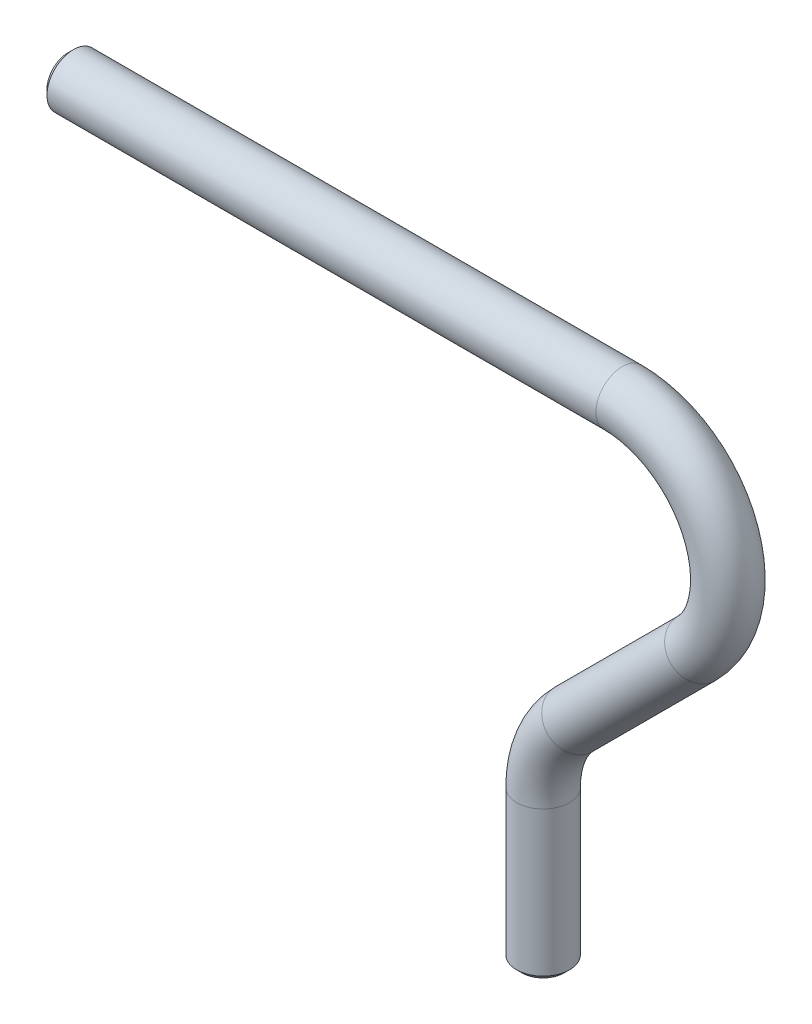
ISO-10303-21;
HEADER;
FILE_DESCRIPTION(('STEP AP214'),'2;1');
FILE_NAME('part.step','',(''),(''),'','','');
FILE_SCHEMA(('AUTOMOTIVE_DESIGN { 1 0 10303 214 1 1 1 1 }'));
ENDSEC;
DATA;
#1=APPLICATION_CONTEXT('core data for automotive mechanical design processes');
#2=APPLICATION_PROTOCOL_DEFINITION('international standard','automotive_design',2000,#1);
#3=PRODUCT_CONTEXT('',#1,'mechanical');
#4=PRODUCT('Part','Part','',(#3));
#5=PRODUCT_RELATED_PRODUCT_CATEGORY('part','',(#4));
#6=PRODUCT_DEFINITION_FORMATION('','',#4);
#7=PRODUCT_DEFINITION_CONTEXT('part definition',#1,'design');
#8=PRODUCT_DEFINITION('design','',#6,#7);
#9=PRODUCT_DEFINITION_SHAPE('','',#8);
#10=(LENGTH_UNIT() NAMED_UNIT(*) SI_UNIT(.MILLI.,.METRE.));
#11=(NAMED_UNIT(*) PLANE_ANGLE_UNIT() SI_UNIT($,.RADIAN.));
#12=(NAMED_UNIT(*) SI_UNIT($,.STERADIAN.) SOLID_ANGLE_UNIT());
#13=UNCERTAINTY_MEASURE_WITH_UNIT(LENGTH_MEASURE(1.E-05),#10,'distance_accuracy_value','');
#14=(GEOMETRIC_REPRESENTATION_CONTEXT(3) GLOBAL_UNCERTAINTY_ASSIGNED_CONTEXT((#13)) GLOBAL_UNIT_ASSIGNED_CONTEXT((#10,
#11,#12)) REPRESENTATION_CONTEXT('',''));
#15=CARTESIAN_POINT('',(0.,0.,0.));
#16=DIRECTION('',(0.,0.,1.));
#17=DIRECTION('',(1.,0.,0.));
#18=AXIS2_PLACEMENT_3D('',#15,#16,#17);
#19=CARTESIAN_POINT('',(0.,0.,0.));
#20=DIRECTION('',(1.,0.,0.));
#21=DIRECTION('',(0.,0.,-1.));
#22=AXIS2_PLACEMENT_3D('',#19,#20,#21);
#23=CYLINDRICAL_SURFACE('',#22,5.);
#24=CARTESIAN_POINT('',(0.999999999999979,0.,0.));
#25=DIRECTION('',(1.,0.,0.));
#26=DIRECTION('',(0.,0.,-1.));
#27=AXIS2_PLACEMENT_3D('',#24,#25,#26);
#28=CIRCLE('',#27,5.);
#29=CARTESIAN_POINT('',(0.999999999999979,0.,-5.));
#30=VERTEX_POINT('',#29);
#31=EDGE_CURVE('E49',#30,#30,#28,.T.);
#32=ORIENTED_EDGE('',*,*,#31,.T.);
#33=EDGE_LOOP('',(#32));
#34=FACE_BOUND('',#33,.T.);
#35=CARTESIAN_POINT('',(105.,0.,0.));
#36=DIRECTION('',(1.,0.,0.));
#37=DIRECTION('',(0.,0.,-1.));
#38=AXIS2_PLACEMENT_3D('',#35,#36,#37);
#39=CIRCLE('',#38,5.);
#40=CARTESIAN_POINT('',(105.,5.,0.));
#41=VERTEX_POINT('',#40);
#42=EDGE_CURVE('E73',#41,#41,#39,.T.);
#43=ORIENTED_EDGE('',*,*,#42,.F.);
#44=EDGE_LOOP('',(#43));
#45=FACE_BOUND('',#44,.T.);
#46=ADVANCED_FACE('F41',(#34,#45),#23,.T.);
#47=CARTESIAN_POINT('',(105.,-20.,0.));
#48=DIRECTION('',(0.,0.,-1.));
#49=DIRECTION('',(-1.,0.,0.));
#50=AXIS2_PLACEMENT_3D('',#47,#48,#49);
#51=TOROIDAL_SURFACE('',#50,20.,5.);
#52=CARTESIAN_POINT('',(119.142135623731,-34.142135623731,0.));
#53=DIRECTION('',(-0.707106781186552,-0.707106781186543,0.));
#54=DIRECTION('',(0.,0.,-1.));
#55=AXIS2_PLACEMENT_3D('',#52,#53,#54);
#56=CIRCLE('',#55,5.);
#57=CARTESIAN_POINT('',(122.677669529664,-37.6776695296638,0.));
#58=VERTEX_POINT('',#57);
#59=EDGE_CURVE('E70',#58,#58,#56,.T.);
#60=CARTESIAN_POINT('',(105.,-20.,0.));
#61=DIRECTION('',(0.,0.,-1.));
#62=DIRECTION('',(-1.,0.,0.));
#63=AXIS2_PLACEMENT_3D('',#60,#61,#62);
#64=CIRCLE('',#63,25.);
#65=EDGE_CURVE('',#41,#58,#64,.T.);
#66=ORIENTED_EDGE('',*,*,#42,.T.);
#67=ORIENTED_EDGE('',*,*,#59,.F.);
#68=ORIENTED_EDGE('',*,*,#65,.T.);
#69=ORIENTED_EDGE('',*,*,#65,.F.);
#70=EDGE_LOOP('',(#66,#68,#67,#69));
#71=FACE_BOUND('',#70,.T.);
#72=ADVANCED_FACE('F172',(#71),#51,.T.);
#73=CARTESIAN_POINT('',(119.142135623731,-34.142135623731,0.));
#74=DIRECTION('',(-0.707106781186551,-0.707106781186544,0.));
#75=DIRECTION('',(0.707106781186544,-0.707106781186551,0.));
#76=AXIS2_PLACEMENT_3D('',#73,#74,#75);
#77=CYLINDRICAL_SURFACE('',#76,5.);
#78=CARTESIAN_POINT('',(95.8578643762691,-57.4264068711925,0.));
#79=DIRECTION('',(-0.707106781186551,-0.707106781186544,0.));
#80=DIRECTION('',(0.,0.,-1.));
#81=AXIS2_PLACEMENT_3D('',#78,#79,#80);
#82=CIRCLE('',#81,5.);
#83=CARTESIAN_POINT('',(92.3223304703364,-53.8908729652598,0.));
#84=VERTEX_POINT('',#83);
#85=EDGE_CURVE('E67',#84,#84,#82,.T.);
#86=ORIENTED_EDGE('',*,*,#85,.F.);
#87=EDGE_LOOP('',(#86));
#88=FACE_BOUND('',#87,.T.);
#89=ORIENTED_EDGE('',*,*,#59,.T.);
#90=EDGE_LOOP('',(#89));
#91=FACE_BOUND('',#90,.T.);
#92=ADVANCED_FACE('F234',(#88,#91),#77,.T.);
#93=CARTESIAN_POINT('',(110.,-71.5685424949236,0.));
#94=DIRECTION('',(0.,0.,1.));
#95=DIRECTION('',(1.,0.,0.));
#96=AXIS2_PLACEMENT_3D('',#93,#94,#95);
#97=TOROIDAL_SURFACE('',#96,20.,5.);
#98=CARTESIAN_POINT('',(90.,-71.5685424949236,0.));
#99=DIRECTION('',(0.,-1.,0.));
#100=DIRECTION('',(0.,0.,-1.));
#101=AXIS2_PLACEMENT_3D('',#98,#99,#100);
#102=CIRCLE('',#101,5.);
#103=CARTESIAN_POINT('',(85.,-71.5685424949236,0.));
#104=VERTEX_POINT('',#103);
#105=EDGE_CURVE('E63',#104,#104,#102,.T.);
#106=CARTESIAN_POINT('',(110.,-71.5685424949236,0.));
#107=DIRECTION('',(0.,0.,1.));
#108=DIRECTION('',(1.,0.,0.));
#109=AXIS2_PLACEMENT_3D('',#106,#107,#108);
#110=CIRCLE('',#109,25.);
#111=EDGE_CURVE('',#84,#104,#110,.T.);
#112=ORIENTED_EDGE('',*,*,#85,.T.);
#113=ORIENTED_EDGE('',*,*,#105,.F.);
#114=ORIENTED_EDGE('',*,*,#111,.T.);
#115=ORIENTED_EDGE('',*,*,#111,.F.);
#116=EDGE_LOOP('',(#112,#114,#113,#115));
#117=FACE_BOUND('',#116,.T.);
#118=ADVANCED_FACE('F106',(#117),#97,.T.);
#119=CARTESIAN_POINT('',(90.,-71.5685424949236,0.));
#120=DIRECTION('',(0.,-1.,0.));
#121=DIRECTION('',(0.,0.,-1.));
#122=AXIS2_PLACEMENT_3D('',#119,#120,#121);
#123=CYLINDRICAL_SURFACE('',#122,5.);
#124=CARTESIAN_POINT('',(90.,-99.,0.));
#125=DIRECTION('',(0.,-1.,0.));
#126=DIRECTION('',(0.,0.,-1.));
#127=AXIS2_PLACEMENT_3D('',#124,#125,#126);
#128=CIRCLE('',#127,5.);
#129=CARTESIAN_POINT('',(90.,-99.,-5.));
#130=VERTEX_POINT('',#129);
#131=EDGE_CURVE('E53',#130,#130,#128,.F.);
#132=ORIENTED_EDGE('',*,*,#131,.T.);
#133=EDGE_LOOP('',(#132));
#134=FACE_BOUND('',#133,.T.);
#135=ORIENTED_EDGE('',*,*,#105,.T.);
#136=EDGE_LOOP('',(#135));
#137=FACE_BOUND('',#136,.T.);
#138=ADVANCED_FACE('F98',(#134,#137),#123,.T.);
#139=CARTESIAN_POINT('',(0.,0.,0.));
#140=DIRECTION('',(1.,0.,0.));
#141=DIRECTION('',(0.,0.,-1.));
#142=AXIS2_PLACEMENT_3D('',#139,#140,#141);
#143=PLANE('',#142);
#144=CARTESIAN_POINT('',(0.,0.,0.));
#145=DIRECTION('',(1.,0.,0.));
#146=DIRECTION('',(0.,0.,-1.));
#147=AXIS2_PLACEMENT_3D('',#144,#145,#146);
#148=CIRCLE('',#147,4.00000000000002);
#149=CARTESIAN_POINT('',(0.,0.,-4.00000000000002));
#150=VERTEX_POINT('',#149);
#151=EDGE_CURVE('E10',#150,#150,#148,.F.);
#152=ORIENTED_EDGE('',*,*,#151,.T.);
#153=EDGE_LOOP('',(#152));
#154=FACE_BOUND('',#153,.T.);
#155=CARTESIAN_POINT('',(0.,0.,0.));
#156=DIRECTION('',(1.,0.,0.));
#157=DIRECTION('',(0.,0.,-1.));
#158=AXIS2_PLACEMENT_3D('',#155,#156,#157);
#159=CIRCLE('',#158,3.);
#160=CARTESIAN_POINT('',(0.,0.,-3.));
#161=VERTEX_POINT('',#160);
#162=EDGE_CURVE('E66',#161,#161,#159,.F.);
#163=ORIENTED_EDGE('',*,*,#162,.F.);
#164=EDGE_LOOP('',(#163));
#165=FACE_BOUND('',#164,.T.);
#166=ADVANCED_FACE('F95',(#154,#165),#143,.F.);
#167=CARTESIAN_POINT('',(90.,-100.,0.));
#168=DIRECTION('',(0.,-1.,0.));
#169=DIRECTION('',(0.,0.,-1.));
#170=AXIS2_PLACEMENT_3D('',#167,#168,#169);
#171=PLANE('',#170);
#172=CARTESIAN_POINT('',(90.,-100.,0.));
#173=DIRECTION('',(0.,-1.,0.));
#174=DIRECTION('',(0.,0.,-1.));
#175=AXIS2_PLACEMENT_3D('',#172,#173,#174);
#176=CIRCLE('',#175,4.00000000000002);
#177=CARTESIAN_POINT('',(90.,-100.,-4.00000000000002));
#178=VERTEX_POINT('',#177);
#179=EDGE_CURVE('E57',#178,#178,#176,.T.);
#180=ORIENTED_EDGE('',*,*,#179,.T.);
#181=EDGE_LOOP('',(#180));
#182=FACE_BOUND('',#181,.T.);
#183=CARTESIAN_POINT('',(90.,-100.,0.));
#184=DIRECTION('',(0.,-1.,0.));
#185=DIRECTION('',(0.,0.,-1.));
#186=AXIS2_PLACEMENT_3D('',#183,#184,#185);
#187=CIRCLE('',#186,3.);
#188=CARTESIAN_POINT('',(90.,-100.,-3.));
#189=VERTEX_POINT('',#188);
#190=EDGE_CURVE('E62',#189,#189,#187,.F.);
#191=ORIENTED_EDGE('',*,*,#190,.T.);
#192=EDGE_LOOP('',(#191));
#193=FACE_BOUND('',#192,.T.);
#194=ADVANCED_FACE('F97',(#182,#193),#171,.T.);
#195=CARTESIAN_POINT('',(0.,0.,0.));
#196=DIRECTION('',(1.,0.,0.));
#197=DIRECTION('',(0.,0.,-1.));
#198=AXIS2_PLACEMENT_3D('',#195,#196,#197);
#199=CYLINDRICAL_SURFACE('',#198,3.);
#200=CARTESIAN_POINT('',(105.,0.,0.));
#201=DIRECTION('',(1.,0.,0.));
#202=DIRECTION('',(0.,0.,-1.));
#203=AXIS2_PLACEMENT_3D('',#200,#201,#202);
#204=CIRCLE('',#203,3.);
#205=CARTESIAN_POINT('',(105.,3.,0.));
#206=VERTEX_POINT('',#205);
#207=EDGE_CURVE('E87',#206,#206,#204,.F.);
#208=ORIENTED_EDGE('',*,*,#207,.F.);
#209=EDGE_LOOP('',(#208));
#210=FACE_BOUND('',#209,.T.);
#211=ORIENTED_EDGE('',*,*,#162,.T.);
#212=EDGE_LOOP('',(#211));
#213=FACE_BOUND('',#212,.T.);
#214=ADVANCED_FACE('F93',(#210,#213),#199,.F.);
#215=CARTESIAN_POINT('',(105.,-20.,0.));
#216=DIRECTION('',(0.,0.,-1.));
#217=DIRECTION('',(-1.,0.,0.));
#218=AXIS2_PLACEMENT_3D('',#215,#216,#217);
#219=TOROIDAL_SURFACE('',#218,20.,3.);
#220=CARTESIAN_POINT('',(119.142135623731,-34.142135623731,0.));
#221=DIRECTION('',(-0.707106781186552,-0.707106781186543,0.));
#222=DIRECTION('',(0.,0.,-1.));
#223=AXIS2_PLACEMENT_3D('',#220,#221,#222);
#224=CIRCLE('',#223,3.);
#225=CARTESIAN_POINT('',(121.26345596729,-36.2634559672907,0.));
#226=VERTEX_POINT('',#225);
#227=EDGE_CURVE('E84',#226,#226,#224,.F.);
#228=CARTESIAN_POINT('',(105.,-20.,0.));
#229=DIRECTION('',(0.,0.,-1.));
#230=DIRECTION('',(-1.,0.,0.));
#231=AXIS2_PLACEMENT_3D('',#228,#229,#230);
#232=CIRCLE('',#231,23.);
#233=EDGE_CURVE('',#206,#226,#232,.T.);
#234=ORIENTED_EDGE('',*,*,#207,.T.);
#235=ORIENTED_EDGE('',*,*,#227,.F.);
#236=ORIENTED_EDGE('',*,*,#233,.T.);
#237=ORIENTED_EDGE('',*,*,#233,.F.);
#238=EDGE_LOOP('',(#234,#236,#235,#237));
#239=FACE_BOUND('',#238,.T.);
#240=ADVANCED_FACE('F129',(#239),#219,.F.);
#241=CARTESIAN_POINT('',(119.142135623731,-34.142135623731,0.));
#242=DIRECTION('',(-0.707106781186551,-0.707106781186544,0.));
#243=DIRECTION('',(0.707106781186544,-0.707106781186551,0.));
#244=AXIS2_PLACEMENT_3D('',#241,#242,#243);
#245=CYLINDRICAL_SURFACE('',#244,3.);
#246=CARTESIAN_POINT('',(95.8578643762691,-57.4264068711925,0.));
#247=DIRECTION('',(-0.707106781186551,-0.707106781186544,0.));
#248=DIRECTION('',(0.,0.,-1.));
#249=AXIS2_PLACEMENT_3D('',#246,#247,#248);
#250=CIRCLE('',#249,3.);
#251=CARTESIAN_POINT('',(93.7365440327095,-55.3050865276329,0.));
#252=VERTEX_POINT('',#251);
#253=EDGE_CURVE('E81',#252,#252,#250,.F.);
#254=ORIENTED_EDGE('',*,*,#253,.F.);
#255=EDGE_LOOP('',(#254));
#256=FACE_BOUND('',#255,.T.);
#257=ORIENTED_EDGE('',*,*,#227,.T.);
#258=EDGE_LOOP('',(#257));
#259=FACE_BOUND('',#258,.T.);
#260=ADVANCED_FACE('F121',(#256,#259),#245,.F.);
#261=CARTESIAN_POINT('',(110.,-71.5685424949236,0.));
#262=DIRECTION('',(0.,0.,1.));
#263=DIRECTION('',(1.,0.,0.));
#264=AXIS2_PLACEMENT_3D('',#261,#262,#263);
#265=TOROIDAL_SURFACE('',#264,20.,3.);
#266=CARTESIAN_POINT('',(90.,-71.5685424949236,0.));
#267=DIRECTION('',(0.,-1.,0.));
#268=DIRECTION('',(0.,0.,-1.));
#269=AXIS2_PLACEMENT_3D('',#266,#267,#268);
#270=CIRCLE('',#269,3.);
#271=CARTESIAN_POINT('',(87.,-71.5685424949236,0.));
#272=VERTEX_POINT('',#271);
#273=EDGE_CURVE('E78',#272,#272,#270,.F.);
#274=CARTESIAN_POINT('',(110.,-71.5685424949236,0.));
#275=DIRECTION('',(0.,0.,1.));
#276=DIRECTION('',(1.,0.,0.));
#277=AXIS2_PLACEMENT_3D('',#274,#275,#276);
#278=CIRCLE('',#277,23.);
#279=EDGE_CURVE('',#252,#272,#278,.T.);
#280=ORIENTED_EDGE('',*,*,#253,.T.);
#281=ORIENTED_EDGE('',*,*,#273,.F.);
#282=ORIENTED_EDGE('',*,*,#279,.T.);
#283=ORIENTED_EDGE('',*,*,#279,.F.);
#284=EDGE_LOOP('',(#280,#282,#281,#283));
#285=FACE_BOUND('',#284,.T.);
#286=ADVANCED_FACE('F113',(#285),#265,.F.);
#287=CARTESIAN_POINT('',(90.,-71.5685424949236,0.));
#288=DIRECTION('',(0.,-1.,0.));
#289=DIRECTION('',(0.,0.,-1.));
#290=AXIS2_PLACEMENT_3D('',#287,#288,#289);
#291=CYLINDRICAL_SURFACE('',#290,3.);
#292=ORIENTED_EDGE('',*,*,#190,.F.);
#293=EDGE_LOOP('',(#292));
#294=FACE_BOUND('',#293,.T.);
#295=ORIENTED_EDGE('',*,*,#273,.T.);
#296=EDGE_LOOP('',(#295));
#297=FACE_BOUND('',#296,.T.);
#298=ADVANCED_FACE('F110',(#294,#297),#291,.F.);
#299=CARTESIAN_POINT('',(90.,-100.,0.));
#300=DIRECTION('',(0.,1.,0.));
#301=DIRECTION('',(0.,0.,1.));
#302=AXIS2_PLACEMENT_3D('',#299,#300,#301);
#303=CONICAL_SURFACE('',#302,4.00000000000002,0.785398163397446);
#304=ORIENTED_EDGE('',*,*,#131,.F.);
#305=EDGE_LOOP('',(#304));
#306=FACE_BOUND('',#305,.T.);
#307=ORIENTED_EDGE('',*,*,#179,.F.);
#308=EDGE_LOOP('',(#307));
#309=FACE_BOUND('',#308,.T.);
#310=ADVANCED_FACE('F112',(#306,#309),#303,.T.);
#311=CARTESIAN_POINT('',(0.999999999999979,0.,0.));
#312=DIRECTION('',(1.,0.,0.));
#313=DIRECTION('',(0.,0.,-1.));
#314=AXIS2_PLACEMENT_3D('',#311,#312,#313);
#315=CONICAL_SURFACE('',#314,5.,0.78539816339745);
#316=ORIENTED_EDGE('',*,*,#151,.F.);
#317=EDGE_LOOP('',(#316));
#318=FACE_BOUND('',#317,.T.);
#319=ORIENTED_EDGE('',*,*,#31,.F.);
#320=EDGE_LOOP('',(#319));
#321=FACE_BOUND('',#320,.T.);
#322=ADVANCED_FACE('F44',(#318,#321),#315,.T.);
#323=CLOSED_SHELL('',(#46,#72,#92,#118,#138,#166,#194,#214,#240,#260,#286,#298,#310,#322));
#324=MANIFOLD_SOLID_BREP('B2',#323);
#325=ADVANCED_BREP_SHAPE_REPRESENTATION('',(#18,#324),#14);
#326=SHAPE_DEFINITION_REPRESENTATION(#9,#325);
ENDSEC;
END-ISO-10303-21;
